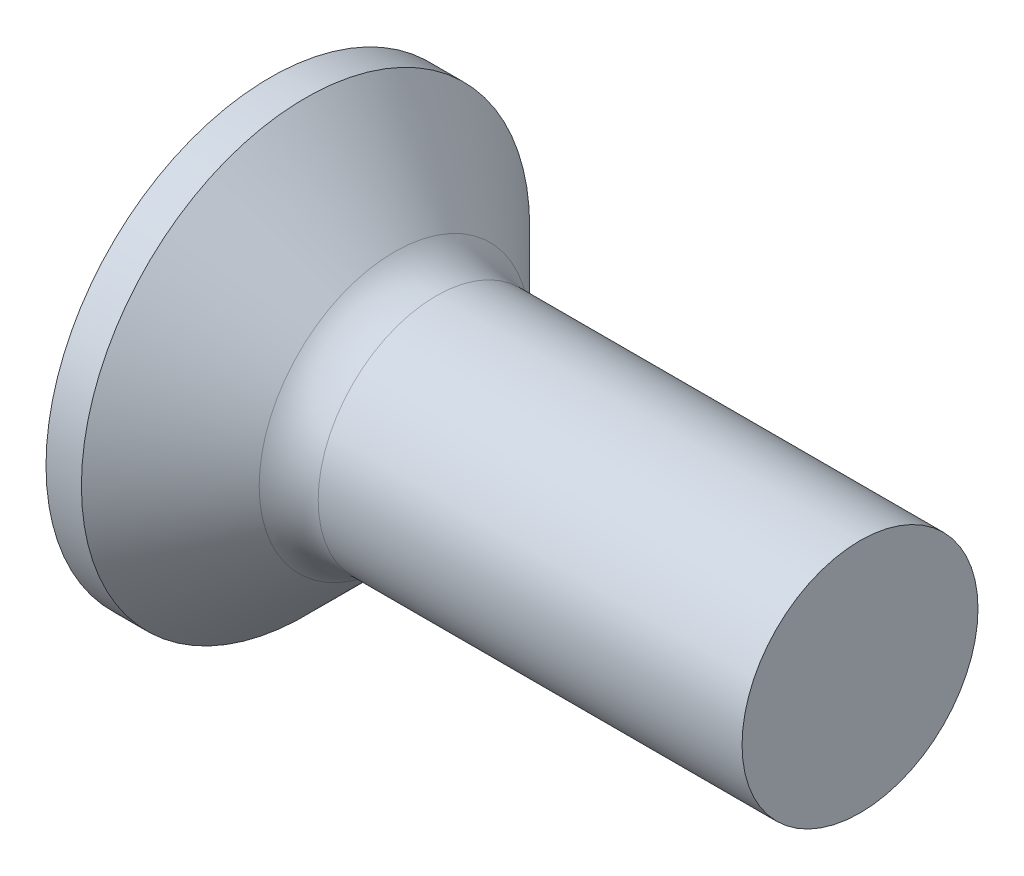
ISO-10303-21;
HEADER;
FILE_DESCRIPTION(('STEP AP214'),'2;1');
FILE_NAME('part.step','',(''),(''),'','','');
FILE_SCHEMA(('AUTOMOTIVE_DESIGN { 1 0 10303 214 1 1 1 1 }'));
ENDSEC;
DATA;
#1=APPLICATION_CONTEXT('core data for automotive mechanical design processes');
#2=APPLICATION_PROTOCOL_DEFINITION('international standard','automotive_design',2000,#1);
#3=PRODUCT_CONTEXT('',#1,'mechanical');
#4=PRODUCT('Part','Part','',(#3));
#5=PRODUCT_RELATED_PRODUCT_CATEGORY('part','',(#4));
#6=PRODUCT_DEFINITION_FORMATION('','',#4);
#7=PRODUCT_DEFINITION_CONTEXT('part definition',#1,'design');
#8=PRODUCT_DEFINITION('design','',#6,#7);
#9=PRODUCT_DEFINITION_SHAPE('','',#8);
#10=(LENGTH_UNIT() NAMED_UNIT(*) SI_UNIT(.MILLI.,.METRE.));
#11=(NAMED_UNIT(*) PLANE_ANGLE_UNIT() SI_UNIT($,.RADIAN.));
#12=(NAMED_UNIT(*) SI_UNIT($,.STERADIAN.) SOLID_ANGLE_UNIT());
#13=UNCERTAINTY_MEASURE_WITH_UNIT(LENGTH_MEASURE(1.E-05),#10,'distance_accuracy_value','');
#14=(GEOMETRIC_REPRESENTATION_CONTEXT(3) GLOBAL_UNCERTAINTY_ASSIGNED_CONTEXT((#13)) GLOBAL_UNIT_ASSIGNED_CONTEXT((#10,
#11,#12)) REPRESENTATION_CONTEXT('',''));
#15=CARTESIAN_POINT('',(0.,0.,0.));
#16=DIRECTION('',(0.,0.,1.));
#17=DIRECTION('',(1.,0.,0.));
#18=AXIS2_PLACEMENT_3D('',#15,#16,#17);
#19=CARTESIAN_POINT('',(0.,0.,0.));
#20=DIRECTION('',(-1.,0.,0.));
#21=DIRECTION('',(0.,0.,1.));
#22=AXIS2_PLACEMENT_3D('',#19,#20,#21);
#23=PLANE('',#22);
#24=CARTESIAN_POINT('',(0.,0.,0.));
#25=DIRECTION('',(-1.,0.,0.));
#26=DIRECTION('',(0.,0.,1.));
#27=AXIS2_PLACEMENT_3D('',#24,#25,#26);
#28=CIRCLE('',#27,1.9);
#29=CARTESIAN_POINT('',(0.,0.,1.9));
#30=VERTEX_POINT('',#29);
#31=EDGE_CURVE('E341',#30,#30,#28,.T.);
#32=ORIENTED_EDGE('',*,*,#31,.T.);
#33=EDGE_LOOP('',(#32));
#34=FACE_BOUND('',#33,.T.);
#35=DIRECTION('',(0.,0.,-1.));
#36=VECTOR('',#35,1.);
#37=CARTESIAN_POINT('',(0.,-0.240000000000003,0.95));
#38=LINE('',#37,#36);
#39=CARTESIAN_POINT('',(0.,-0.240000000000003,0.95));
#40=VERTEX_POINT('',#39);
#41=CARTESIAN_POINT('',(0.,-0.240000000000001,0.368080234393744));
#42=VERTEX_POINT('',#41);
#43=EDGE_CURVE('E380',#40,#42,#38,.T.);
#44=ORIENTED_EDGE('',*,*,#43,.T.);
#45=CARTESIAN_POINT('',(0.,0.,0.));
#46=DIRECTION('',(-1.,0.,0.));
#47=DIRECTION('',(0.,0.,1.));
#48=AXIS2_PLACEMENT_3D('',#45,#46,#47);
#49=CIRCLE('',#48,0.439412174332203);
#50=CARTESIAN_POINT('',(0.,-0.368080234393745,0.24));
#51=VERTEX_POINT('',#50);
#52=EDGE_CURVE('E367',#51,#42,#49,.T.);
#53=ORIENTED_EDGE('',*,*,#52,.F.);
#54=DIRECTION('',(0.,-1.,0.));
#55=VECTOR('',#54,1.);
#56=CARTESIAN_POINT('',(0.,0.95,0.24));
#57=LINE('',#56,#55);
#58=CARTESIAN_POINT('',(0.,-0.949999999999999,0.24));
#59=VERTEX_POINT('',#58);
#60=EDGE_CURVE('E427',#51,#59,#57,.T.);
#61=ORIENTED_EDGE('',*,*,#60,.T.);
#62=DIRECTION('',(0.,0.,-1.));
#63=VECTOR('',#62,1.);
#64=CARTESIAN_POINT('',(0.,-0.949999999999999,0.24));
#65=LINE('',#64,#63);
#66=CARTESIAN_POINT('',(0.,-0.949999999999999,-0.239999999999999));
#67=VERTEX_POINT('',#66);
#68=EDGE_CURVE('E338',#59,#67,#65,.T.);
#69=ORIENTED_EDGE('',*,*,#68,.T.);
#70=DIRECTION('',(0.,1.,0.));
#71=VECTOR('',#70,1.);
#72=CARTESIAN_POINT('',(0.,-0.949999999999999,-0.239999999999999));
#73=LINE('',#72,#71);
#74=CARTESIAN_POINT('',(0.,-0.368080234393745,-0.239999999999999));
#75=VERTEX_POINT('',#74);
#76=EDGE_CURVE('E428',#67,#75,#73,.T.);
#77=ORIENTED_EDGE('',*,*,#76,.T.);
#78=CARTESIAN_POINT('',(0.,-0.239999999999999,-0.368080234393746));
#79=VERTEX_POINT('',#78);
#80=EDGE_CURVE('E373',#79,#75,#49,.T.);
#81=ORIENTED_EDGE('',*,*,#80,.F.);
#82=CARTESIAN_POINT('',(0.,-0.239999999999997,-0.95));
#83=VERTEX_POINT('',#82);
#84=EDGE_CURVE('E389',#79,#83,#38,.T.);
#85=ORIENTED_EDGE('',*,*,#84,.T.);
#86=DIRECTION('',(0.,1.,0.));
#87=VECTOR('',#86,1.);
#88=CARTESIAN_POINT('',(0.,-0.239999999999997,-0.95));
#89=LINE('',#88,#87);
#90=CARTESIAN_POINT('',(0.,0.240000000000003,-0.949999999999998));
#91=VERTEX_POINT('',#90);
#92=EDGE_CURVE('E388',#83,#91,#89,.T.);
#93=ORIENTED_EDGE('',*,*,#92,.T.);
#94=DIRECTION('',(0.,0.,1.));
#95=VECTOR('',#94,1.);
#96=CARTESIAN_POINT('',(0.,0.240000000000003,-0.949999999999998));
#97=LINE('',#96,#95);
#98=CARTESIAN_POINT('',(0.,0.240000000000001,-0.368080234393744));
#99=VERTEX_POINT('',#98);
#100=EDGE_CURVE('E395',#91,#99,#97,.T.);
#101=ORIENTED_EDGE('',*,*,#100,.T.);
#102=CARTESIAN_POINT('',(0.,0.368080234393745,-0.239999999999999));
#103=VERTEX_POINT('',#102);
#104=EDGE_CURVE('E463',#103,#99,#49,.T.);
#105=ORIENTED_EDGE('',*,*,#104,.F.);
#106=CARTESIAN_POINT('',(0.,0.95,-0.239999999999999));
#107=VERTEX_POINT('',#106);
#108=EDGE_CURVE('E436',#103,#107,#73,.T.);
#109=ORIENTED_EDGE('',*,*,#108,.T.);
#110=DIRECTION('',(0.,0.,1.));
#111=VECTOR('',#110,1.);
#112=CARTESIAN_POINT('',(0.,0.95,-0.239999999999999));
#113=LINE('',#112,#111);
#114=CARTESIAN_POINT('',(0.,0.95,0.24));
#115=VERTEX_POINT('',#114);
#116=EDGE_CURVE('E424',#107,#115,#113,.T.);
#117=ORIENTED_EDGE('',*,*,#116,.T.);
#118=CARTESIAN_POINT('',(0.,0.368080234393745,0.24));
#119=VERTEX_POINT('',#118);
#120=EDGE_CURVE('E429',#115,#119,#57,.T.);
#121=ORIENTED_EDGE('',*,*,#120,.T.);
#122=CARTESIAN_POINT('',(0.,0.239999999999998,0.368080234393746));
#123=VERTEX_POINT('',#122);
#124=EDGE_CURVE('E375',#123,#119,#49,.T.);
#125=ORIENTED_EDGE('',*,*,#124,.F.);
#126=CARTESIAN_POINT('',(0.,0.239999999999996,0.950000000000001));
#127=VERTEX_POINT('',#126);
#128=EDGE_CURVE('E398',#123,#127,#97,.T.);
#129=ORIENTED_EDGE('',*,*,#128,.T.);
#130=DIRECTION('',(0.,-1.,0.));
#131=VECTOR('',#130,1.);
#132=CARTESIAN_POINT('',(0.,0.239999999999996,0.950000000000001));
#133=LINE('',#132,#131);
#134=EDGE_CURVE('E387',#127,#40,#133,.T.);
#135=ORIENTED_EDGE('',*,*,#134,.T.);
#136=EDGE_LOOP('',(#44,#53,#61,#69,#77,#81,#85,#93,#101,#105,#109,#117,#121,#125,#129,#135));
#137=FACE_BOUND('',#136,.T.);
#138=ADVANCED_FACE('F34',(#34,#137),#23,.T.);
#139=CARTESIAN_POINT('',(1.2,-0.35170209098021,0.24));
#140=DIRECTION('',(0.,0.,-1.));
#141=DIRECTION('',(-1.,0.,0.));
#142=AXIS2_PLACEMENT_3D('',#139,#140,#141);
#143=PLANE('',#142);
#144=ORIENTED_EDGE('',*,*,#60,.F.);
#145=CARTESIAN_POINT('',(-0.647693210410766,-0.421114336989015,0.24));
#146=CARTESIAN_POINT('',(-0.514503449530111,-0.410390261082206,0.24));
#147=CARTESIAN_POINT('',(-0.381320940222105,-0.399574318209683,0.24));
#148=CARTESIAN_POINT('',(-0.114973765651316,-0.377686644383827,0.24));
#149=CARTESIAN_POINT('',(0.0181908991098696,-0.36661490733336,0.24));
#150=CARTESIAN_POINT('',(0.284492634009301,-0.344144100394437,0.24));
#151=CARTESIAN_POINT('',(0.417629704158519,-0.332745030636382,0.24));
#152=CARTESIAN_POINT('',(0.683863247571634,-0.309504122508586,0.24));
#153=CARTESIAN_POINT('',(0.816959721449588,-0.297662291208839,0.24));
#154=CARTESIAN_POINT('',(1.04303435436914,-0.277010154535522,0.24));
#155=CARTESIAN_POINT('',(1.13602713244054,-0.268360479227262,0.24));
#156=CARTESIAN_POINT('',(1.32197255818582,-0.250648380042692,0.24));
#157=CARTESIAN_POINT('',(1.41492520621454,-0.241585959894734,0.24));
#158=CARTESIAN_POINT('',(1.60078125424125,-0.222904447219643,0.24));
#159=CARTESIAN_POINT('',(1.69368465085292,-0.213285320436498,0.24));
#160=CARTESIAN_POINT('',(1.8793987441832,-0.193166747196933,0.24));
#161=CARTESIAN_POINT('',(1.97220943765284,-0.182667270911613,0.24));
#162=CARTESIAN_POINT('',(2.06495176785102,-0.171565852394699,0.24));
#163=B_SPLINE_CURVE_WITH_KNOTS('',3,(#145,#146,#147,#148,#149,#150,#151,#152,#153,#154,#155,
#156,#157,#158,#159,#160,#161,#162),.UNSPECIFIED.,.F.,.F.,(4,2,2,2,2,2,2,2,4),(0.,
0.400862588720512,0.801734742318302,1.20260673621982,1.60347233174809,1.88365413958718,
2.16383341702737,2.44402995319874,2.72423598711459),.UNSPECIFIED.);
#164=CARTESIAN_POINT('',(1.2,-0.262259890185287,0.240000000000001));
#165=VERTEX_POINT('',#164);
#166=EDGE_CURVE('E370',#51,#165,#163,.T.);
#167=ORIENTED_EDGE('',*,*,#166,.T.);
#168=DIRECTION('',(0.,-1.,0.));
#169=VECTOR('',#168,1.);
#170=CARTESIAN_POINT('',(1.2,0.351702090980209,0.24));
#171=LINE('',#170,#169);
#172=CARTESIAN_POINT('',(1.2,-0.35170209098021,0.24));
#173=VERTEX_POINT('',#172);
#174=EDGE_CURVE('E443',#165,#173,#171,.T.);
#175=ORIENTED_EDGE('',*,*,#174,.T.);
#176=DIRECTION('',(0.894934367749961,0.446197800778957,0.));
#177=VECTOR('',#176,1.);
#178=CARTESIAN_POINT('',(0.,-0.949999999999999,0.24));
#179=LINE('',#178,#177);
#180=EDGE_CURVE('E316',#59,#173,#179,.T.);
#181=ORIENTED_EDGE('',*,*,#180,.F.);
#182=EDGE_LOOP('',(#144,#167,#175,#181));
#183=FACE_BOUND('',#182,.T.);
#184=ADVANCED_FACE('F188',(#183),#143,.T.);
#185=CARTESIAN_POINT('',(1.2,0.351702090980209,0.24));
#186=VERTEX_POINT('',#185);
#187=CARTESIAN_POINT('',(1.2,0.262259890185287,0.240000000000001));
#188=VERTEX_POINT('',#187);
#189=EDGE_CURVE('E325',#186,#188,#171,.T.);
#190=ORIENTED_EDGE('',*,*,#189,.T.);
#191=CARTESIAN_POINT('',(-0.647693210410766,0.421114336989016,0.24));
#192=CARTESIAN_POINT('',(-0.514503449530111,0.410390261082206,0.24));
#193=CARTESIAN_POINT('',(-0.381320940222105,0.399574318209683,0.24));
#194=CARTESIAN_POINT('',(-0.114973765651316,0.377686644383827,0.24));
#195=CARTESIAN_POINT('',(0.01819089910987,0.36661490733336,0.24));
#196=CARTESIAN_POINT('',(0.284492634009302,0.344144100394437,0.24));
#197=CARTESIAN_POINT('',(0.417629704158519,0.332745030636382,0.24));
#198=CARTESIAN_POINT('',(0.683863247571635,0.309504122508586,0.24));
#199=CARTESIAN_POINT('',(0.816959721449588,0.29766229120884,0.24));
#200=CARTESIAN_POINT('',(1.04303435436914,0.277010154535522,0.24));
#201=CARTESIAN_POINT('',(1.13602713244054,0.268360479227262,0.24));
#202=CARTESIAN_POINT('',(1.32197255818582,0.250648380042692,0.24));
#203=CARTESIAN_POINT('',(1.41492520621454,0.241585959894734,0.24));
#204=CARTESIAN_POINT('',(1.60078125424125,0.222904447219643,0.24));
#205=CARTESIAN_POINT('',(1.69368465085292,0.213285320436498,0.24));
#206=CARTESIAN_POINT('',(1.8793987441832,0.193166747196933,0.24));
#207=CARTESIAN_POINT('',(1.97220943765284,0.182667270911613,0.24));
#208=CARTESIAN_POINT('',(2.06495176785102,0.171565852394699,0.24));
#209=B_SPLINE_CURVE_WITH_KNOTS('',3,(#191,#192,#193,#194,#195,#196,#197,#198,#199,#200,#201,
#202,#203,#204,#205,#206,#207,#208),.UNSPECIFIED.,.F.,.F.,(4,2,2,2,2,2,2,2,4),(0.,
0.400862588720512,0.801734742318302,1.20260673621982,1.60347233174809,1.88365413958718,
2.16383341702737,2.44402995319874,2.72423598711459),.UNSPECIFIED.);
#210=EDGE_CURVE('E248',#188,#119,#209,.F.);
#211=ORIENTED_EDGE('',*,*,#210,.T.);
#212=ORIENTED_EDGE('',*,*,#120,.F.);
#213=DIRECTION('',(0.89493436774996,-0.446197800778958,0.));
#214=VECTOR('',#213,1.);
#215=CARTESIAN_POINT('',(0.,0.95,0.24));
#216=LINE('',#215,#214);
#217=EDGE_CURVE('E57',#115,#186,#216,.T.);
#218=ORIENTED_EDGE('',*,*,#217,.T.);
#219=EDGE_LOOP('',(#190,#211,#212,#218));
#220=FACE_BOUND('',#219,.T.);
#221=ADVANCED_FACE('F193',(#220),#143,.T.);
#222=CARTESIAN_POINT('',(1.2,0.351702090980209,-0.24));
#223=DIRECTION('',(0.,0.,1.));
#224=DIRECTION('',(1.,0.,0.));
#225=AXIS2_PLACEMENT_3D('',#222,#223,#224);
#226=PLANE('',#225);
#227=DIRECTION('',(0.,1.,0.));
#228=VECTOR('',#227,1.);
#229=CARTESIAN_POINT('',(1.2,-0.35170209098021,-0.24));
#230=LINE('',#229,#228);
#231=CARTESIAN_POINT('',(1.2,-0.35170209098021,-0.24));
#232=VERTEX_POINT('',#231);
#233=CARTESIAN_POINT('',(1.2,-0.262259890185287,-0.24));
#234=VERTEX_POINT('',#233);
#235=EDGE_CURVE('E329',#232,#234,#230,.T.);
#236=ORIENTED_EDGE('',*,*,#235,.T.);
#237=CARTESIAN_POINT('',(-0.647693210410766,-0.421114336989016,-0.239999999999999));
#238=CARTESIAN_POINT('',(-0.514503449530111,-0.410390261082207,-0.239999999999999));
#239=CARTESIAN_POINT('',(-0.381320940222105,-0.399574318209683,-0.239999999999999));
#240=CARTESIAN_POINT('',(-0.114973765651316,-0.377686644383827,-0.239999999999999));
#241=CARTESIAN_POINT('',(0.0181908991098699,-0.36661490733336,-0.239999999999999));
#242=CARTESIAN_POINT('',(0.284492634009302,-0.344144100394437,-0.239999999999999));
#243=CARTESIAN_POINT('',(0.417629704158519,-0.332745030636383,-0.24));
#244=CARTESIAN_POINT('',(0.683863247571635,-0.309504122508587,-0.24));
#245=CARTESIAN_POINT('',(0.816959721449588,-0.29766229120884,-0.24));
#246=CARTESIAN_POINT('',(1.04303435436914,-0.277010154535522,-0.24));
#247=CARTESIAN_POINT('',(1.13602713244054,-0.268360479227262,-0.24));
#248=CARTESIAN_POINT('',(1.32197255818582,-0.250648380042692,-0.24));
#249=CARTESIAN_POINT('',(1.41492520621454,-0.241585959894734,-0.24));
#250=CARTESIAN_POINT('',(1.60078125424125,-0.222904447219643,-0.24));
#251=CARTESIAN_POINT('',(1.69368465085292,-0.213285320436498,-0.24));
#252=CARTESIAN_POINT('',(1.8793987441832,-0.193166747196933,-0.24));
#253=CARTESIAN_POINT('',(1.97220943765284,-0.182667270911613,-0.24));
#254=CARTESIAN_POINT('',(2.06495176785102,-0.171565852394699,-0.24));
#255=B_SPLINE_CURVE_WITH_KNOTS('',3,(#237,#238,#239,#240,#241,#242,#243,#244,#245,#246,#247,
#248,#249,#250,#251,#252,#253,#254),.UNSPECIFIED.,.F.,.F.,(4,2,2,2,2,2,2,2,4),(0.,
0.400862588720512,0.801734742318302,1.20260673621982,1.60347233174809,1.88365413958718,
2.16383341702737,2.44402995319874,2.72423598711459),.UNSPECIFIED.);
#256=EDGE_CURVE('E242',#234,#75,#255,.F.);
#257=ORIENTED_EDGE('',*,*,#256,.T.);
#258=ORIENTED_EDGE('',*,*,#76,.F.);
#259=DIRECTION('',(0.894934367749961,0.446197800778957,0.));
#260=VECTOR('',#259,1.);
#261=CARTESIAN_POINT('',(0.,-0.949999999999999,-0.239999999999999));
#262=LINE('',#261,#260);
#263=EDGE_CURVE('E438',#67,#232,#262,.T.);
#264=ORIENTED_EDGE('',*,*,#263,.T.);
#265=EDGE_LOOP('',(#236,#257,#258,#264));
#266=FACE_BOUND('',#265,.T.);
#267=ADVANCED_FACE('F228',(#266),#226,.T.);
#268=ORIENTED_EDGE('',*,*,#108,.F.);
#269=CARTESIAN_POINT('',(-0.647693210410766,0.421114336989016,-0.239999999999999));
#270=CARTESIAN_POINT('',(-0.514503449530111,0.410390261082207,-0.239999999999999));
#271=CARTESIAN_POINT('',(-0.381320940222105,0.399574318209683,-0.239999999999999));
#272=CARTESIAN_POINT('',(-0.114973765651316,0.377686644383827,-0.239999999999999));
#273=CARTESIAN_POINT('',(0.0181908991098699,0.36661490733336,-0.239999999999999));
#274=CARTESIAN_POINT('',(0.284492634009302,0.344144100394437,-0.239999999999999));
#275=CARTESIAN_POINT('',(0.417629704158519,0.332745030636383,-0.24));
#276=CARTESIAN_POINT('',(0.683863247571635,0.309504122508587,-0.24));
#277=CARTESIAN_POINT('',(0.816959721449588,0.29766229120884,-0.24));
#278=CARTESIAN_POINT('',(1.04303435436914,0.277010154535523,-0.24));
#279=CARTESIAN_POINT('',(1.13602713244054,0.268360479227262,-0.24));
#280=CARTESIAN_POINT('',(1.32197255818582,0.250648380042692,-0.24));
#281=CARTESIAN_POINT('',(1.41492520621454,0.241585959894734,-0.24));
#282=CARTESIAN_POINT('',(1.60078125424125,0.222904447219643,-0.24));
#283=CARTESIAN_POINT('',(1.69368465085292,0.213285320436498,-0.24));
#284=CARTESIAN_POINT('',(1.8793987441832,0.193166747196933,-0.24));
#285=CARTESIAN_POINT('',(1.97220943765284,0.182667270911613,-0.24));
#286=CARTESIAN_POINT('',(2.06495176785102,0.171565852394699,-0.24));
#287=B_SPLINE_CURVE_WITH_KNOTS('',3,(#269,#270,#271,#272,#273,#274,#275,#276,#277,#278,#279,
#280,#281,#282,#283,#284,#285,#286),.UNSPECIFIED.,.F.,.F.,(4,2,2,2,2,2,2,2,4),(0.,
0.400862588720512,0.801734742318302,1.20260673621982,1.60347233174809,1.88365413958718,
2.16383341702737,2.44402995319874,2.72423598711459),.UNSPECIFIED.);
#288=CARTESIAN_POINT('',(1.2,0.262259890185287,-0.24));
#289=VERTEX_POINT('',#288);
#290=EDGE_CURVE('E236',#103,#289,#287,.T.);
#291=ORIENTED_EDGE('',*,*,#290,.T.);
#292=CARTESIAN_POINT('',(1.2,0.351702090980209,-0.24));
#293=VERTEX_POINT('',#292);
#294=EDGE_CURVE('E333',#289,#293,#230,.T.);
#295=ORIENTED_EDGE('',*,*,#294,.T.);
#296=DIRECTION('',(0.89493436774996,-0.446197800778958,0.));
#297=VECTOR('',#296,1.);
#298=CARTESIAN_POINT('',(0.,0.95,-0.239999999999999));
#299=LINE('',#298,#297);
#300=EDGE_CURVE('E320',#107,#293,#299,.T.);
#301=ORIENTED_EDGE('',*,*,#300,.F.);
#302=EDGE_LOOP('',(#268,#291,#295,#301));
#303=FACE_BOUND('',#302,.T.);
#304=ADVANCED_FACE('F220',(#303),#226,.T.);
#305=CARTESIAN_POINT('',(1.2,0.351702090980209,-0.24));
#306=DIRECTION('',(1.,0.,0.));
#307=DIRECTION('',(0.,0.,-1.));
#308=AXIS2_PLACEMENT_3D('',#305,#306,#307);
#309=PLANE('',#308);
#310=CARTESIAN_POINT('',(1.2,0.,0.));
#311=DIRECTION('',(-1.,0.,0.));
#312=DIRECTION('',(0.,0.,1.));
#313=AXIS2_PLACEMENT_3D('',#310,#311,#312);
#314=CIRCLE('',#313,0.355499999999999);
#315=CARTESIAN_POINT('',(1.2,-0.0518255651213496,-0.35170209098021));
#316=VERTEX_POINT('',#315);
#317=CARTESIAN_POINT('',(1.2,-0.239999999999999,-0.262259890185288));
#318=VERTEX_POINT('',#317);
#319=EDGE_CURVE('E510',#316,#318,#314,.T.);
#320=ORIENTED_EDGE('',*,*,#319,.F.);
#321=DIRECTION('',(0.,1.,0.));
#322=VECTOR('',#321,1.);
#323=CARTESIAN_POINT('',(1.2,-0.239999999999999,-0.35170209098021));
#324=LINE('',#323,#322);
#325=CARTESIAN_POINT('',(1.2,-0.239999999999999,-0.35170209098021));
#326=VERTEX_POINT('',#325);
#327=EDGE_CURVE('E410',#326,#316,#324,.T.);
#328=ORIENTED_EDGE('',*,*,#327,.F.);
#329=DIRECTION('',(0.,0.,-1.));
#330=VECTOR('',#329,1.);
#331=CARTESIAN_POINT('',(1.2,-0.240000000000001,0.351702090980208));
#332=LINE('',#331,#330);
#333=EDGE_CURVE('E414',#318,#326,#332,.T.);
#334=ORIENTED_EDGE('',*,*,#333,.F.);
#335=EDGE_LOOP('',(#320,#328,#334));
#336=FACE_BOUND('',#335,.T.);
#337=ADVANCED_FACE('F216',(#336),#309,.F.);
#338=CARTESIAN_POINT('',(1.2,-0.35170209098021,-0.0518255651213508));
#339=VERTEX_POINT('',#338);
#340=EDGE_CURVE('E481',#234,#339,#314,.T.);
#341=ORIENTED_EDGE('',*,*,#340,.F.);
#342=ORIENTED_EDGE('',*,*,#235,.F.);
#343=DIRECTION('',(0.,0.,-1.));
#344=VECTOR('',#343,1.);
#345=CARTESIAN_POINT('',(1.2,-0.35170209098021,0.24));
#346=LINE('',#345,#344);
#347=EDGE_CURVE('E321',#339,#232,#346,.T.);
#348=ORIENTED_EDGE('',*,*,#347,.F.);
#349=EDGE_LOOP('',(#341,#342,#348));
#350=FACE_BOUND('',#349,.T.);
#351=ADVANCED_FACE('F219',(#350),#309,.F.);
#352=CARTESIAN_POINT('',(1.2,-0.35170209098021,0.0518255651213508));
#353=VERTEX_POINT('',#352);
#354=EDGE_CURVE('E477',#353,#165,#314,.T.);
#355=ORIENTED_EDGE('',*,*,#354,.F.);
#356=EDGE_CURVE('E311',#173,#353,#346,.T.);
#357=ORIENTED_EDGE('',*,*,#356,.F.);
#358=ORIENTED_EDGE('',*,*,#174,.F.);
#359=EDGE_LOOP('',(#355,#357,#358));
#360=FACE_BOUND('',#359,.T.);
#361=ADVANCED_FACE('F475',(#360),#309,.F.);
#362=CARTESIAN_POINT('',(1.2,-0.240000000000001,0.262259890185287));
#363=VERTEX_POINT('',#362);
#364=CARTESIAN_POINT('',(1.2,-0.0518255651213509,0.351702090980209));
#365=VERTEX_POINT('',#364);
#366=EDGE_CURVE('E49',#363,#365,#314,.T.);
#367=ORIENTED_EDGE('',*,*,#366,.F.);
#368=CARTESIAN_POINT('',(1.2,-0.240000000000001,0.351702090980208));
#369=VERTEX_POINT('',#368);
#370=EDGE_CURVE('E383',#369,#363,#332,.T.);
#371=ORIENTED_EDGE('',*,*,#370,.F.);
#372=DIRECTION('',(0.,-1.,0.));
#373=VECTOR('',#372,1.);
#374=CARTESIAN_POINT('',(1.2,0.239999999999999,0.35170209098021));
#375=LINE('',#374,#373);
#376=EDGE_CURVE('E415',#365,#369,#375,.T.);
#377=ORIENTED_EDGE('',*,*,#376,.F.);
#378=EDGE_LOOP('',(#367,#371,#377));
#379=FACE_BOUND('',#378,.T.);
#380=ADVANCED_FACE('F521',(#379),#309,.F.);
#381=CARTESIAN_POINT('',(1.2,0.0518255651213534,0.351702090980209));
#382=VERTEX_POINT('',#381);
#383=CARTESIAN_POINT('',(1.2,0.239999999999999,0.262259890185289));
#384=VERTEX_POINT('',#383);
#385=EDGE_CURVE('E374',#382,#384,#314,.T.);
#386=ORIENTED_EDGE('',*,*,#385,.F.);
#387=CARTESIAN_POINT('',(1.2,0.239999999999999,0.35170209098021));
#388=VERTEX_POINT('',#387);
#389=EDGE_CURVE('E411',#388,#382,#375,.T.);
#390=ORIENTED_EDGE('',*,*,#389,.F.);
#391=DIRECTION('',(0.,0.,1.));
#392=VECTOR('',#391,1.);
#393=CARTESIAN_POINT('',(1.2,0.240000000000001,-0.351702090980209));
#394=LINE('',#393,#392);
#395=EDGE_CURVE('E423',#384,#388,#394,.T.);
#396=ORIENTED_EDGE('',*,*,#395,.F.);
#397=EDGE_LOOP('',(#386,#390,#396));
#398=FACE_BOUND('',#397,.T.);
#399=ADVANCED_FACE('F486',(#398),#309,.F.);
#400=CARTESIAN_POINT('',(1.2,0.351702090980209,0.0518255651213546));
#401=VERTEX_POINT('',#400);
#402=EDGE_CURVE('E455',#188,#401,#314,.T.);
#403=ORIENTED_EDGE('',*,*,#402,.F.);
#404=ORIENTED_EDGE('',*,*,#189,.F.);
#405=DIRECTION('',(0.,0.,1.));
#406=VECTOR('',#405,1.);
#407=CARTESIAN_POINT('',(1.2,0.351702090980209,-0.24));
#408=LINE('',#407,#406);
#409=EDGE_CURVE('E332',#401,#186,#408,.T.);
#410=ORIENTED_EDGE('',*,*,#409,.F.);
#411=EDGE_LOOP('',(#403,#404,#410));
#412=FACE_BOUND('',#411,.T.);
#413=ADVANCED_FACE('F453',(#412),#309,.F.);
#414=CARTESIAN_POINT('',(1.2,0.351702090980209,-0.0518255651213546));
#415=VERTEX_POINT('',#414);
#416=EDGE_CURVE('E461',#415,#289,#314,.T.);
#417=ORIENTED_EDGE('',*,*,#416,.F.);
#418=EDGE_CURVE('E441',#293,#415,#408,.T.);
#419=ORIENTED_EDGE('',*,*,#418,.F.);
#420=ORIENTED_EDGE('',*,*,#294,.F.);
#421=EDGE_LOOP('',(#417,#419,#420));
#422=FACE_BOUND('',#421,.T.);
#423=ADVANCED_FACE('F305',(#422),#309,.F.);
#424=CARTESIAN_POINT('',(1.2,0.240000000000001,-0.262259890185287));
#425=VERTEX_POINT('',#424);
#426=CARTESIAN_POINT('',(1.2,0.051825565121352,-0.35170209098021));
#427=VERTEX_POINT('',#426);
#428=EDGE_CURVE('E504',#425,#427,#314,.T.);
#429=ORIENTED_EDGE('',*,*,#428,.F.);
#430=CARTESIAN_POINT('',(1.2,0.240000000000001,-0.351702090980209));
#431=VERTEX_POINT('',#430);
#432=EDGE_CURVE('E420',#431,#425,#394,.T.);
#433=ORIENTED_EDGE('',*,*,#432,.F.);
#434=EDGE_CURVE('E417',#427,#431,#324,.T.);
#435=ORIENTED_EDGE('',*,*,#434,.F.);
#436=EDGE_LOOP('',(#429,#433,#435));
#437=FACE_BOUND('',#436,.T.);
#438=ADVANCED_FACE('F222',(#437),#309,.F.);
#439=CARTESIAN_POINT('',(1.2,-0.35170209098021,-0.24));
#440=DIRECTION('',(-0.446197800778957,0.894934367749961,0.));
#441=DIRECTION('',(-0.894934367749961,-0.446197800778957,0.));
#442=AXIS2_PLACEMENT_3D('',#439,#440,#441);
#443=PLANE('',#442);
#444=ORIENTED_EDGE('',*,*,#356,.T.);
#445=CARTESIAN_POINT('',(1.81755030037573,-0.0438028797890923,0.));
#446=DIRECTION('',(-0.446197800778957,0.894934367749961,0.));
#447=DIRECTION('',(-0.894934367749961,-0.446197800778957,0.));
#448=AXIS2_PLACEMENT_3D('',#445,#446,#447);
#449=ELLIPSE('',#448,0.699951178008363,0.309229710740658);
#450=EDGE_CURVE('E312',#353,#339,#449,.F.);
#451=ORIENTED_EDGE('',*,*,#450,.T.);
#452=ORIENTED_EDGE('',*,*,#347,.T.);
#453=ORIENTED_EDGE('',*,*,#263,.F.);
#454=ORIENTED_EDGE('',*,*,#68,.F.);
#455=ORIENTED_EDGE('',*,*,#180,.T.);
#456=EDGE_LOOP('',(#444,#451,#452,#453,#454,#455));
#457=FACE_BOUND('',#456,.T.);
#458=ADVANCED_FACE('F227',(#457),#443,.T.);
#459=CARTESIAN_POINT('',(0.,0.95,0.24));
#460=DIRECTION('',(-0.446197800778958,-0.89493436774996,0.));
#461=DIRECTION('',(0.89493436774996,-0.446197800778958,0.));
#462=AXIS2_PLACEMENT_3D('',#459,#460,#461);
#463=PLANE('',#462);
#464=ORIENTED_EDGE('',*,*,#418,.T.);
#465=CARTESIAN_POINT('',(1.81755030037572,0.0438028797890925,0.));
#466=DIRECTION('',(-0.446197800778958,-0.89493436774996,0.));
#467=DIRECTION('',(-0.89493436774996,0.446197800778958,0.));
#468=AXIS2_PLACEMENT_3D('',#465,#466,#467);
#469=ELLIPSE('',#468,0.699951178008361,0.309229710740658);
#470=EDGE_CURVE('E289',#415,#401,#469,.F.);
#471=ORIENTED_EDGE('',*,*,#470,.T.);
#472=ORIENTED_EDGE('',*,*,#409,.T.);
#473=ORIENTED_EDGE('',*,*,#217,.F.);
#474=ORIENTED_EDGE('',*,*,#116,.F.);
#475=ORIENTED_EDGE('',*,*,#300,.T.);
#476=EDGE_LOOP('',(#464,#471,#472,#473,#474,#475));
#477=FACE_BOUND('',#476,.T.);
#478=ADVANCED_FACE('F223',(#477),#463,.T.);
#479=CARTESIAN_POINT('',(1.2,0.239999999999999,0.35170209098021));
#480=DIRECTION('',(0.,-1.,0.));
#481=DIRECTION('',(1.,0.,0.));
#482=AXIS2_PLACEMENT_3D('',#479,#480,#481);
#483=PLANE('',#482);
#484=ORIENTED_EDGE('',*,*,#432,.T.);
#485=CARTESIAN_POINT('',(-0.647693210410766,0.24,-0.421114336989015));
#486=CARTESIAN_POINT('',(-0.514503449530111,0.24,-0.410390261082206));
#487=CARTESIAN_POINT('',(-0.381320940222105,0.240000000000001,-0.399574318209683));
#488=CARTESIAN_POINT('',(-0.114973765651316,0.240000000000001,-0.377686644383827));
#489=CARTESIAN_POINT('',(0.0181908991098698,0.240000000000001,-0.36661490733336));
#490=CARTESIAN_POINT('',(0.284492634009301,0.240000000000001,-0.344144100394436));
#491=CARTESIAN_POINT('',(0.417629704158519,0.240000000000001,-0.332745030636382));
#492=CARTESIAN_POINT('',(0.683863247571634,0.240000000000001,-0.309504122508586));
#493=CARTESIAN_POINT('',(0.816959721449587,0.240000000000001,-0.297662291208839));
#494=CARTESIAN_POINT('',(1.04303435436914,0.240000000000001,-0.277010154535522));
#495=CARTESIAN_POINT('',(1.13602713244054,0.240000000000001,-0.268360479227261));
#496=CARTESIAN_POINT('',(1.32197255818582,0.240000000000001,-0.250648380042692));
#497=CARTESIAN_POINT('',(1.41492520621454,0.240000000000001,-0.241585959894734));
#498=CARTESIAN_POINT('',(1.60078125424125,0.240000000000001,-0.222904447219642));
#499=CARTESIAN_POINT('',(1.69368465085292,0.240000000000001,-0.213285320436497));
#500=CARTESIAN_POINT('',(1.8793987441832,0.240000000000001,-0.193166747196932));
#501=CARTESIAN_POINT('',(1.97220943765284,0.240000000000001,-0.182667270911612));
#502=CARTESIAN_POINT('',(2.06495176785102,0.240000000000001,-0.171565852394698));
#503=B_SPLINE_CURVE_WITH_KNOTS('',3,(#485,#486,#487,#488,#489,#490,#491,#492,#493,#494,#495,
#496,#497,#498,#499,#500,#501,#502),.UNSPECIFIED.,.F.,.F.,(4,2,2,2,2,2,2,2,4),(0.,
0.400862588720512,0.801734742318302,1.20260673621982,1.60347233174809,1.88365413958718,
2.16383341702737,2.44402995319874,2.72423598711459),.UNSPECIFIED.);
#504=EDGE_CURVE('E282',#425,#99,#503,.F.);
#505=ORIENTED_EDGE('',*,*,#504,.T.);
#506=ORIENTED_EDGE('',*,*,#100,.F.);
#507=DIRECTION('',(0.894934367749961,0.,0.446197800778957));
#508=VECTOR('',#507,1.);
#509=CARTESIAN_POINT('',(0.,0.240000000000003,-0.949999999999998));
#510=LINE('',#509,#508);
#511=EDGE_CURVE('E402',#91,#431,#510,.T.);
#512=ORIENTED_EDGE('',*,*,#511,.T.);
#513=EDGE_LOOP('',(#484,#505,#506,#512));
#514=FACE_BOUND('',#513,.T.);
#515=ADVANCED_FACE('F226',(#514),#483,.T.);
#516=CARTESIAN_POINT('',(1.2,-0.239999999999999,-0.35170209098021));
#517=DIRECTION('',(0.,1.,0.));
#518=DIRECTION('',(-1.,0.,0.));
#519=AXIS2_PLACEMENT_3D('',#516,#517,#518);
#520=PLANE('',#519);
#521=ORIENTED_EDGE('',*,*,#84,.F.);
#522=CARTESIAN_POINT('',(-0.647693210421637,-0.239999999999998,-0.421114336989891));
#523=CARTESIAN_POINT('',(-0.514503449539821,-0.239999999999998,-0.410390261082994));
#524=CARTESIAN_POINT('',(-0.381320940230653,-0.239999999999999,-0.399574318210382));
#525=CARTESIAN_POINT('',(-0.114973765657541,-0.239999999999999,-0.377686644384344));
#526=CARTESIAN_POINT('',(0.0181908991048065,-0.239999999999999,-0.366614907333785));
#527=CARTESIAN_POINT('',(0.284492634007953,-0.239999999999999,-0.344144100394555));
#528=CARTESIAN_POINT('',(0.417629704159725,-0.239999999999999,-0.332745030636282));
#529=CARTESIAN_POINT('',(0.683863247577946,-0.239999999999999,-0.309504122508032));
#530=CARTESIAN_POINT('',(0.816959721458451,-0.239999999999999,-0.297662291208049));
#531=CARTESIAN_POINT('',(1.04303435438055,-0.239999999999999,-0.277010154534468));
#532=CARTESIAN_POINT('',(1.13602713245195,-0.239999999999999,-0.268360479226193));
#533=CARTESIAN_POINT('',(1.32197255819723,-0.239999999999999,-0.250648380041589));
#534=CARTESIAN_POINT('',(1.41492520622595,-0.24,-0.241585959893612));
#535=CARTESIAN_POINT('',(1.60078125425266,-0.24,-0.222904447218473));
#536=CARTESIAN_POINT('',(1.69368465086432,-0.24,-0.213285320435301));
#537=CARTESIAN_POINT('',(1.87939874419459,-0.24,-0.193166747195665));
#538=CARTESIAN_POINT('',(1.97220943766423,-0.24,-0.182667270910301));
#539=CARTESIAN_POINT('',(2.0649517678624,-0.24,-0.171565852393331));
#540=B_SPLINE_CURVE_WITH_KNOTS('',3,(#522,#523,#524,#525,#526,#527,#528,#529,#530,#531,#532,
#533,#534,#535,#536,#537,#538,#539),.UNSPECIFIED.,.F.,.F.,(4,2,2,2,2,2,2,2,4),(0.,
0.400862588724007,0.801734742325292,1.2026067362345,1.60347233177046,1.88365413960954,
2.16383341704974,2.44402995322111,2.72423598713696),.UNSPECIFIED.);
#541=EDGE_CURVE('E276',#79,#318,#540,.T.);
#542=ORIENTED_EDGE('',*,*,#541,.T.);
#543=ORIENTED_EDGE('',*,*,#333,.T.);
#544=DIRECTION('',(0.894934367749961,0.,0.446197800778957));
#545=VECTOR('',#544,1.);
#546=CARTESIAN_POINT('',(0.,-0.239999999999997,-0.95));
#547=LINE('',#546,#545);
#548=EDGE_CURVE('E399',#83,#326,#547,.T.);
#549=ORIENTED_EDGE('',*,*,#548,.F.);
#550=EDGE_LOOP('',(#521,#542,#543,#549));
#551=FACE_BOUND('',#550,.T.);
#552=ADVANCED_FACE('F293',(#551),#520,.T.);
#553=CARTESIAN_POINT('',(1.2,0.240000000000001,-0.351702090980209));
#554=DIRECTION('',(-0.446197800778957,0.,0.894934367749961));
#555=DIRECTION('',(-0.894934367749961,0.,-0.446197800778957));
#556=AXIS2_PLACEMENT_3D('',#553,#554,#555);
#557=PLANE('',#556);
#558=ORIENTED_EDGE('',*,*,#327,.T.);
#559=CARTESIAN_POINT('',(1.81755030037573,0.,-0.0438028797890923));
#560=DIRECTION('',(-0.446197800778957,0.,0.894934367749961));
#561=DIRECTION('',(-0.894934367749961,0.,-0.446197800778957));
#562=AXIS2_PLACEMENT_3D('',#559,#560,#561);
#563=ELLIPSE('',#562,0.699951178008363,0.309229710740658);
#564=EDGE_CURVE('E384',#316,#427,#563,.F.);
#565=ORIENTED_EDGE('',*,*,#564,.T.);
#566=ORIENTED_EDGE('',*,*,#434,.T.);
#567=ORIENTED_EDGE('',*,*,#511,.F.);
#568=ORIENTED_EDGE('',*,*,#92,.F.);
#569=ORIENTED_EDGE('',*,*,#548,.T.);
#570=EDGE_LOOP('',(#558,#565,#566,#567,#568,#569));
#571=FACE_BOUND('',#570,.T.);
#572=ADVANCED_FACE('F255',(#571),#557,.T.);
#573=ORIENTED_EDGE('',*,*,#370,.T.);
#574=CARTESIAN_POINT('',(-0.647693210410766,-0.240000000000001,0.421114336989015));
#575=CARTESIAN_POINT('',(-0.514503449530111,-0.240000000000001,0.410390261082206));
#576=CARTESIAN_POINT('',(-0.381320940222105,-0.240000000000001,0.399574318209682));
#577=CARTESIAN_POINT('',(-0.114973765651316,-0.240000000000001,0.377686644383826));
#578=CARTESIAN_POINT('',(0.0181908991098699,-0.240000000000001,0.366614907333359));
#579=CARTESIAN_POINT('',(0.284492634009302,-0.240000000000001,0.344144100394436));
#580=CARTESIAN_POINT('',(0.417629704158519,-0.240000000000001,0.332745030636382));
#581=CARTESIAN_POINT('',(0.683863247571635,-0.240000000000001,0.309504122508585));
#582=CARTESIAN_POINT('',(0.816959721449588,-0.240000000000001,0.297662291208839));
#583=CARTESIAN_POINT('',(1.04303435436914,-0.240000000000001,0.277010154535521));
#584=CARTESIAN_POINT('',(1.13602713244054,-0.240000000000001,0.268360479227261));
#585=CARTESIAN_POINT('',(1.32197255818582,-0.240000000000001,0.250648380042691));
#586=CARTESIAN_POINT('',(1.41492520621454,-0.240000000000001,0.241585959894733));
#587=CARTESIAN_POINT('',(1.60078125424125,-0.240000000000001,0.222904447219642));
#588=CARTESIAN_POINT('',(1.69368465085292,-0.240000000000001,0.213285320436497));
#589=CARTESIAN_POINT('',(1.8793987441832,-0.240000000000001,0.193166747196932));
#590=CARTESIAN_POINT('',(1.97220943765284,-0.240000000000001,0.182667270911612));
#591=CARTESIAN_POINT('',(2.06495176785102,-0.240000000000001,0.171565852394698));
#592=B_SPLINE_CURVE_WITH_KNOTS('',3,(#574,#575,#576,#577,#578,#579,#580,#581,#582,#583,#584,
#585,#586,#587,#588,#589,#590,#591),.UNSPECIFIED.,.F.,.F.,(4,2,2,2,2,2,2,2,4),(0.,
0.400862588720512,0.801734742318302,1.20260673621982,1.60347233174809,1.88365413958718,
2.16383341702737,2.44402995319874,2.72423598711459),.UNSPECIFIED.);
#593=EDGE_CURVE('E269',#363,#42,#592,.F.);
#594=ORIENTED_EDGE('',*,*,#593,.T.);
#595=ORIENTED_EDGE('',*,*,#43,.F.);
#596=DIRECTION('',(0.89493436774996,0.,-0.446197800778958));
#597=VECTOR('',#596,1.);
#598=CARTESIAN_POINT('',(0.,-0.240000000000003,0.95));
#599=LINE('',#598,#597);
#600=EDGE_CURVE('E405',#40,#369,#599,.T.);
#601=ORIENTED_EDGE('',*,*,#600,.T.);
#602=EDGE_LOOP('',(#573,#594,#595,#601));
#603=FACE_BOUND('',#602,.T.);
#604=ADVANCED_FACE('F378',(#603),#520,.T.);
#605=ORIENTED_EDGE('',*,*,#128,.F.);
#606=CARTESIAN_POINT('',(-0.647693210421637,0.239999999999998,0.421114336989892));
#607=CARTESIAN_POINT('',(-0.514503449539821,0.239999999999998,0.410390261082994));
#608=CARTESIAN_POINT('',(-0.381320940230653,0.239999999999998,0.399574318210382));
#609=CARTESIAN_POINT('',(-0.114973765657541,0.239999999999998,0.377686644384345));
#610=CARTESIAN_POINT('',(0.0181908991048067,0.239999999999998,0.366614907333785));
#611=CARTESIAN_POINT('',(0.284492634007954,0.239999999999998,0.344144100394555));
#612=CARTESIAN_POINT('',(0.417629704159725,0.239999999999998,0.332745030636282));
#613=CARTESIAN_POINT('',(0.683863247577946,0.239999999999999,0.309504122508032));
#614=CARTESIAN_POINT('',(0.816959721458451,0.239999999999999,0.297662291208049));
#615=CARTESIAN_POINT('',(1.04303435438055,0.239999999999999,0.277010154534468));
#616=CARTESIAN_POINT('',(1.13602713245195,0.239999999999999,0.268360479226193));
#617=CARTESIAN_POINT('',(1.32197255819723,0.239999999999999,0.250648380041589));
#618=CARTESIAN_POINT('',(1.41492520622595,0.239999999999999,0.241585959893612));
#619=CARTESIAN_POINT('',(1.60078125425266,0.239999999999999,0.222904447218473));
#620=CARTESIAN_POINT('',(1.69368465086432,0.24,0.213285320435301));
#621=CARTESIAN_POINT('',(1.87939874419459,0.24,0.193166747195665));
#622=CARTESIAN_POINT('',(1.97220943766423,0.24,0.182667270910301));
#623=CARTESIAN_POINT('',(2.0649517678624,0.24,0.171565852393331));
#624=B_SPLINE_CURVE_WITH_KNOTS('',3,(#606,#607,#608,#609,#610,#611,#612,#613,#614,#615,#616,
#617,#618,#619,#620,#621,#622,#623),.UNSPECIFIED.,.F.,.F.,(4,2,2,2,2,2,2,2,4),(0.,
0.400862588724007,0.801734742325292,1.2026067362345,1.60347233177046,1.88365413960954,
2.16383341704974,2.4440299532211,2.72423598713696),.UNSPECIFIED.);
#625=EDGE_CURVE('E260',#123,#384,#624,.T.);
#626=ORIENTED_EDGE('',*,*,#625,.T.);
#627=ORIENTED_EDGE('',*,*,#395,.T.);
#628=DIRECTION('',(0.89493436774996,0.,-0.446197800778958));
#629=VECTOR('',#628,1.);
#630=CARTESIAN_POINT('',(0.,0.239999999999996,0.950000000000001));
#631=LINE('',#630,#629);
#632=EDGE_CURVE('E407',#127,#388,#631,.T.);
#633=ORIENTED_EDGE('',*,*,#632,.F.);
#634=EDGE_LOOP('',(#605,#626,#627,#633));
#635=FACE_BOUND('',#634,.T.);
#636=ADVANCED_FACE('F295',(#635),#483,.T.);
#637=CARTESIAN_POINT('',(0.,-0.240000000000003,0.95));
#638=DIRECTION('',(-0.446197800778958,0.,-0.89493436774996));
#639=DIRECTION('',(0.89493436774996,0.,-0.446197800778958));
#640=AXIS2_PLACEMENT_3D('',#637,#638,#639);
#641=PLANE('',#640);
#642=ORIENTED_EDGE('',*,*,#389,.T.);
#643=CARTESIAN_POINT('',(1.81755030037572,0.,0.0438028797890925));
#644=DIRECTION('',(-0.446197800778958,0.,-0.89493436774996));
#645=DIRECTION('',(-0.89493436774996,0.,0.446197800778958));
#646=AXIS2_PLACEMENT_3D('',#643,#644,#645);
#647=ELLIPSE('',#646,0.699951178008361,0.309229710740658);
#648=EDGE_CURVE('E11',#382,#365,#647,.F.);
#649=ORIENTED_EDGE('',*,*,#648,.T.);
#650=ORIENTED_EDGE('',*,*,#376,.T.);
#651=ORIENTED_EDGE('',*,*,#600,.F.);
#652=ORIENTED_EDGE('',*,*,#134,.F.);
#653=ORIENTED_EDGE('',*,*,#632,.T.);
#654=EDGE_LOOP('',(#642,#649,#650,#651,#652,#653));
#655=FACE_BOUND('',#654,.T.);
#656=ADVANCED_FACE('F203',(#655),#641,.T.);
#657=CARTESIAN_POINT('',(-6.34999999999999,0.,0.));
#658=DIRECTION('',(-1.,0.,0.));
#659=DIRECTION('',(0.,0.,1.));
#660=AXIS2_PLACEMENT_3D('',#657,#658,#659);
#661=CYLINDRICAL_SURFACE('',#660,1.9);
#662=CARTESIAN_POINT('',(0.300000000000003,0.,0.));
#663=DIRECTION('',(-1.,0.,0.));
#664=DIRECTION('',(0.,0.,1.));
#665=AXIS2_PLACEMENT_3D('',#662,#663,#664);
#666=CIRCLE('',#665,1.9);
#667=CARTESIAN_POINT('',(0.300000000000003,0.,1.9));
#668=VERTEX_POINT('',#667);
#669=EDGE_CURVE('E337',#668,#668,#666,.T.);
#670=ORIENTED_EDGE('',*,*,#669,.T.);
#671=EDGE_LOOP('',(#670));
#672=FACE_BOUND('',#671,.T.);
#673=ORIENTED_EDGE('',*,*,#31,.F.);
#674=EDGE_LOOP('',(#673));
#675=FACE_BOUND('',#674,.T.);
#676=ADVANCED_FACE('F199',(#672,#675),#661,.T.);
#677=CARTESIAN_POINT('',(0.300000000000003,0.,0.));
#678=DIRECTION('',(-1.,0.,0.));
#679=DIRECTION('',(0.,0.,1.));
#680=AXIS2_PLACEMENT_3D('',#677,#678,#679);
#681=CONICAL_SURFACE('',#680,1.9,0.78539816339745);
#682=CARTESIAN_POINT('',(1.05355339059327,0.,0.));
#683=DIRECTION('',(-1.,0.,0.));
#684=DIRECTION('',(0.,0.,1.));
#685=AXIS2_PLACEMENT_3D('',#682,#683,#684);
#686=CIRCLE('',#685,1.14644660940673);
#687=CARTESIAN_POINT('',(1.05355339059327,0.,1.14644660940673));
#688=VERTEX_POINT('',#687);
#689=EDGE_CURVE('E343',#688,#688,#686,.T.);
#690=ORIENTED_EDGE('',*,*,#689,.T.);
#691=EDGE_LOOP('',(#690));
#692=FACE_BOUND('',#691,.T.);
#693=ORIENTED_EDGE('',*,*,#669,.F.);
#694=EDGE_LOOP('',(#693));
#695=FACE_BOUND('',#694,.T.);
#696=ADVANCED_FACE('F202',(#692,#695),#681,.T.);
#697=CARTESIAN_POINT('',(-6.34999999999999,0.,0.));
#698=DIRECTION('',(-1.,0.,0.));
#699=DIRECTION('',(0.,0.,1.));
#700=AXIS2_PLACEMENT_3D('',#697,#698,#699);
#701=CYLINDRICAL_SURFACE('',#700,1.);
#702=CARTESIAN_POINT('',(1.40710678118655,0.,0.));
#703=DIRECTION('',(-1.,0.,0.));
#704=DIRECTION('',(0.,0.,1.));
#705=AXIS2_PLACEMENT_3D('',#702,#703,#704);
#706=CIRCLE('',#705,1.);
#707=CARTESIAN_POINT('',(1.40710678118655,0.,1.));
#708=VERTEX_POINT('',#707);
#709=EDGE_CURVE('E42',#708,#708,#706,.F.);
#710=ORIENTED_EDGE('',*,*,#709,.T.);
#711=EDGE_LOOP('',(#710));
#712=FACE_BOUND('',#711,.T.);
#713=CARTESIAN_POINT('',(5.,0.,0.));
#714=DIRECTION('',(-1.,0.,0.));
#715=DIRECTION('',(0.,0.,1.));
#716=AXIS2_PLACEMENT_3D('',#713,#714,#715);
#717=CIRCLE('',#716,1.);
#718=CARTESIAN_POINT('',(5.,0.,1.));
#719=VERTEX_POINT('',#718);
#720=EDGE_CURVE('E334',#719,#719,#717,.T.);
#721=ORIENTED_EDGE('',*,*,#720,.T.);
#722=EDGE_LOOP('',(#721));
#723=FACE_BOUND('',#722,.T.);
#724=ADVANCED_FACE('F207',(#712,#723),#701,.T.);
#725=CARTESIAN_POINT('',(5.,1.,0.));
#726=DIRECTION('',(1.,0.,0.));
#727=DIRECTION('',(0.,0.,-1.));
#728=AXIS2_PLACEMENT_3D('',#725,#726,#727);
#729=PLANE('',#728);
#730=ORIENTED_EDGE('',*,*,#720,.F.);
#731=EDGE_LOOP('',(#730));
#732=FACE_BOUND('',#731,.T.);
#733=ADVANCED_FACE('F211',(#732),#729,.T.);
#734=CARTESIAN_POINT('',(1.40710678118655,0.,0.));
#735=DIRECTION('',(-1.,0.,0.));
#736=DIRECTION('',(0.,0.,1.));
#737=AXIS2_PLACEMENT_3D('',#734,#735,#736);
#738=TOROIDAL_SURFACE('',#737,1.5,0.5);
#739=ORIENTED_EDGE('',*,*,#709,.F.);
#740=EDGE_LOOP('',(#739));
#741=FACE_BOUND('',#740,.T.);
#742=ORIENTED_EDGE('',*,*,#689,.F.);
#743=EDGE_LOOP('',(#742));
#744=FACE_BOUND('',#743,.T.);
#745=ADVANCED_FACE('F36',(#741,#744),#738,.F.);
#746=CARTESIAN_POINT('',(1.2,0.,0.));
#747=DIRECTION('',(-1.,0.,0.));
#748=DIRECTION('',(0.,0.,1.));
#749=AXIS2_PLACEMENT_3D('',#746,#747,#748);
#750=CONICAL_SURFACE('',#749,0.355499999999999,0.069813170079766);
#751=ORIENTED_EDGE('',*,*,#52,.T.);
#752=ORIENTED_EDGE('',*,*,#593,.F.);
#753=EDGE_CURVE('E480',#165,#363,#314,.T.);
#754=ORIENTED_EDGE('',*,*,#753,.F.);
#755=ORIENTED_EDGE('',*,*,#166,.F.);
#756=EDGE_LOOP('',(#751,#752,#754,#755));
#757=FACE_BOUND('',#756,.T.);
#758=ADVANCED_FACE('F185',(#757),#750,.F.);
#759=EDGE_CURVE('E458',#384,#188,#314,.T.);
#760=ORIENTED_EDGE('',*,*,#759,.F.);
#761=ORIENTED_EDGE('',*,*,#625,.F.);
#762=ORIENTED_EDGE('',*,*,#124,.T.);
#763=ORIENTED_EDGE('',*,*,#210,.F.);
#764=EDGE_LOOP('',(#760,#761,#762,#763));
#765=FACE_BOUND('',#764,.T.);
#766=ADVANCED_FACE('F359',(#765),#750,.F.);
#767=EDGE_CURVE('E513',#318,#234,#314,.T.);
#768=ORIENTED_EDGE('',*,*,#767,.F.);
#769=ORIENTED_EDGE('',*,*,#541,.F.);
#770=ORIENTED_EDGE('',*,*,#80,.T.);
#771=ORIENTED_EDGE('',*,*,#256,.F.);
#772=EDGE_LOOP('',(#768,#769,#770,#771));
#773=FACE_BOUND('',#772,.T.);
#774=ADVANCED_FACE('F364',(#773),#750,.F.);
#775=ORIENTED_EDGE('',*,*,#104,.T.);
#776=ORIENTED_EDGE('',*,*,#504,.F.);
#777=EDGE_CURVE('E503',#289,#425,#314,.T.);
#778=ORIENTED_EDGE('',*,*,#777,.F.);
#779=ORIENTED_EDGE('',*,*,#290,.F.);
#780=EDGE_LOOP('',(#775,#776,#778,#779));
#781=FACE_BOUND('',#780,.T.);
#782=ADVANCED_FACE('F616',(#781),#750,.F.);
#783=EDGE_CURVE('E459',#401,#415,#314,.T.);
#784=ORIENTED_EDGE('',*,*,#783,.F.);
#785=ORIENTED_EDGE('',*,*,#470,.F.);
#786=EDGE_LOOP('',(#784,#785));
#787=FACE_BOUND('',#786,.T.);
#788=ADVANCED_FACE('F624',(#787),#750,.F.);
#789=EDGE_CURVE('E479',#339,#353,#314,.T.);
#790=ORIENTED_EDGE('',*,*,#789,.F.);
#791=ORIENTED_EDGE('',*,*,#450,.F.);
#792=EDGE_LOOP('',(#790,#791));
#793=FACE_BOUND('',#792,.T.);
#794=ADVANCED_FACE('F632',(#793),#750,.F.);
#795=EDGE_CURVE('E507',#427,#316,#314,.T.);
#796=ORIENTED_EDGE('',*,*,#795,.F.);
#797=ORIENTED_EDGE('',*,*,#564,.F.);
#798=EDGE_LOOP('',(#796,#797));
#799=FACE_BOUND('',#798,.T.);
#800=ADVANCED_FACE('F182',(#799),#750,.F.);
#801=EDGE_CURVE('E462',#365,#382,#314,.T.);
#802=ORIENTED_EDGE('',*,*,#801,.F.);
#803=ORIENTED_EDGE('',*,*,#648,.F.);
#804=EDGE_LOOP('',(#802,#803));
#805=FACE_BOUND('',#804,.T.);
#806=ADVANCED_FACE('F177',(#805),#750,.F.);
#807=CARTESIAN_POINT('',(1.31550895201079,0.,0.));
#808=DIRECTION('',(-1.,0.,0.));
#809=DIRECTION('',(0.,0.,1.));
#810=AXIS2_PLACEMENT_3D('',#807,#808,#809);
#811=CONICAL_SURFACE('',#810,0.,1.25663706143592);
#812=ORIENTED_EDGE('',*,*,#385,.T.);
#813=ORIENTED_EDGE('',*,*,#759,.T.);
#814=ORIENTED_EDGE('',*,*,#402,.T.);
#815=ORIENTED_EDGE('',*,*,#783,.T.);
#816=ORIENTED_EDGE('',*,*,#416,.T.);
#817=ORIENTED_EDGE('',*,*,#777,.T.);
#818=ORIENTED_EDGE('',*,*,#428,.T.);
#819=ORIENTED_EDGE('',*,*,#795,.T.);
#820=ORIENTED_EDGE('',*,*,#319,.T.);
#821=ORIENTED_EDGE('',*,*,#767,.T.);
#822=ORIENTED_EDGE('',*,*,#340,.T.);
#823=ORIENTED_EDGE('',*,*,#789,.T.);
#824=ORIENTED_EDGE('',*,*,#354,.T.);
#825=ORIENTED_EDGE('',*,*,#753,.T.);
#826=ORIENTED_EDGE('',*,*,#366,.T.);
#827=ORIENTED_EDGE('',*,*,#801,.T.);
#828=EDGE_LOOP('',(#812,#813,#814,#815,#816,#817,#818,#819,#820,#821,#822,#823,#824,#825,#826,#827));
#829=FACE_BOUND('',#828,.T.);
#830=CARTESIAN_POINT('',(1.31550895201079,0.,0.));
#831=VERTEX_POINT('',#830);
#832=VERTEX_LOOP('',#831);
#833=FACE_BOUND('',#832,.T.);
#834=ADVANCED_FACE('F175',(#829,#833),#811,.F.);
#835=CLOSED_SHELL('',(#138,#184,#221,#267,#304,#337,#351,#361,#380,#399,#413,#423,#438,#458,
#478,#515,#552,#572,#604,#636,#656,#676,#696,#724,#733,#745,#758,#766,#774,#782,#788,#794,#800,
#806,#834));
#836=MANIFOLD_SOLID_BREP('B2',#835);
#837=ADVANCED_BREP_SHAPE_REPRESENTATION('',(#18,#836),#14);
#838=SHAPE_DEFINITION_REPRESENTATION(#9,#837);
ENDSEC;
END-ISO-10303-21;
